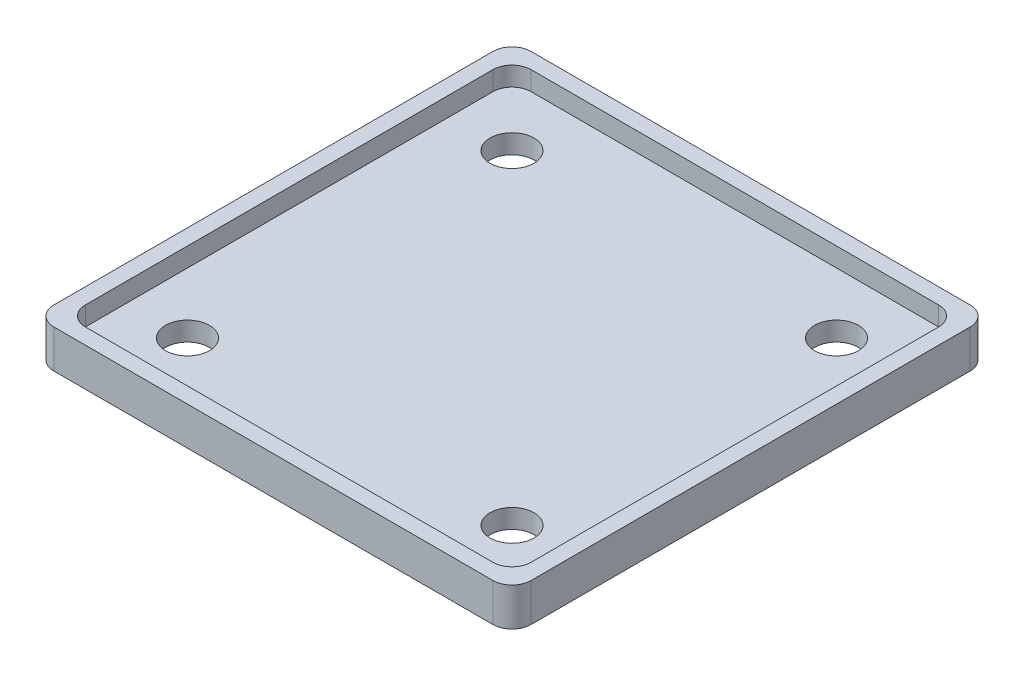
ISO-10303-21;
HEADER;
FILE_DESCRIPTION(('STEP AP214'),'2;1');
FILE_NAME('part.step','',(''),(''),'','','');
FILE_SCHEMA(('AUTOMOTIVE_DESIGN { 1 0 10303 214 1 1 1 1 }'));
ENDSEC;
DATA;
#1=APPLICATION_CONTEXT('core data for automotive mechanical design processes');
#2=APPLICATION_PROTOCOL_DEFINITION('international standard','automotive_design',2000,#1);
#3=PRODUCT_CONTEXT('',#1,'mechanical');
#4=PRODUCT('Part','Part','',(#3));
#5=PRODUCT_RELATED_PRODUCT_CATEGORY('part','',(#4));
#6=PRODUCT_DEFINITION_FORMATION('','',#4);
#7=PRODUCT_DEFINITION_CONTEXT('part definition',#1,'design');
#8=PRODUCT_DEFINITION('design','',#6,#7);
#9=PRODUCT_DEFINITION_SHAPE('','',#8);
#10=(LENGTH_UNIT() NAMED_UNIT(*) SI_UNIT(.MILLI.,.METRE.));
#11=(NAMED_UNIT(*) PLANE_ANGLE_UNIT() SI_UNIT($,.RADIAN.));
#12=(NAMED_UNIT(*) SI_UNIT($,.STERADIAN.) SOLID_ANGLE_UNIT());
#13=UNCERTAINTY_MEASURE_WITH_UNIT(LENGTH_MEASURE(1.E-05),#10,'distance_accuracy_value','');
#14=(GEOMETRIC_REPRESENTATION_CONTEXT(3) GLOBAL_UNCERTAINTY_ASSIGNED_CONTEXT((#13)) GLOBAL_UNIT_ASSIGNED_CONTEXT((#10,
#11,#12)) REPRESENTATION_CONTEXT('',''));
#15=CARTESIAN_POINT('',(0.,0.,0.));
#16=DIRECTION('',(0.,0.,1.));
#17=DIRECTION('',(1.,0.,0.));
#18=AXIS2_PLACEMENT_3D('',#15,#16,#17);
#19=CARTESIAN_POINT('',(-8.5,0.,-8.5));
#20=DIRECTION('',(0.,1.,0.));
#21=DIRECTION('',(0.,0.,1.));
#22=AXIS2_PLACEMENT_3D('',#19,#20,#21);
#23=CYLINDRICAL_SURFACE('',#22,1.15);
#24=CARTESIAN_POINT('',(-8.5,0.,-8.5));
#25=DIRECTION('',(0.,1.,0.));
#26=DIRECTION('',(0.,0.,1.));
#27=AXIS2_PLACEMENT_3D('',#24,#25,#26);
#28=CIRCLE('',#27,1.15);
#29=CARTESIAN_POINT('',(-8.5,0.,-7.35));
#30=VERTEX_POINT('',#29);
#31=EDGE_CURVE('E277',#30,#30,#28,.T.);
#32=ORIENTED_EDGE('',*,*,#31,.F.);
#33=EDGE_LOOP('',(#32));
#34=FACE_BOUND('',#33,.T.);
#35=CARTESIAN_POINT('',(-8.5,1.,-8.5));
#36=DIRECTION('',(0.,1.,0.));
#37=DIRECTION('',(0.,0.,1.));
#38=AXIS2_PLACEMENT_3D('',#35,#36,#37);
#39=CIRCLE('',#38,1.15);
#40=CARTESIAN_POINT('',(-8.5,1.,-7.35));
#41=VERTEX_POINT('',#40);
#42=EDGE_CURVE('E268',#41,#41,#39,.F.);
#43=ORIENTED_EDGE('',*,*,#42,.F.);
#44=EDGE_LOOP('',(#43));
#45=FACE_BOUND('',#44,.T.);
#46=ADVANCED_FACE('F45',(#34,#45),#23,.F.);
#47=CARTESIAN_POINT('',(-8.5,0.,8.5));
#48=DIRECTION('',(0.,1.,0.));
#49=DIRECTION('',(0.,0.,1.));
#50=AXIS2_PLACEMENT_3D('',#47,#48,#49);
#51=CYLINDRICAL_SURFACE('',#50,1.15);
#52=CARTESIAN_POINT('',(-8.5,0.,8.5));
#53=DIRECTION('',(0.,1.,0.));
#54=DIRECTION('',(0.,0.,-1.));
#55=AXIS2_PLACEMENT_3D('',#52,#53,#54);
#56=CIRCLE('',#55,1.15);
#57=CARTESIAN_POINT('',(-8.5,0.,7.35));
#58=VERTEX_POINT('',#57);
#59=EDGE_CURVE('E273',#58,#58,#56,.T.);
#60=ORIENTED_EDGE('',*,*,#59,.F.);
#61=EDGE_LOOP('',(#60));
#62=FACE_BOUND('',#61,.T.);
#63=CARTESIAN_POINT('',(-8.5,1.,8.5));
#64=DIRECTION('',(0.,1.,0.));
#65=DIRECTION('',(0.,0.,1.));
#66=AXIS2_PLACEMENT_3D('',#63,#64,#65);
#67=CIRCLE('',#66,1.15);
#68=CARTESIAN_POINT('',(-8.5,1.,9.65));
#69=VERTEX_POINT('',#68);
#70=EDGE_CURVE('E264',#69,#69,#67,.F.);
#71=ORIENTED_EDGE('',*,*,#70,.F.);
#72=EDGE_LOOP('',(#71));
#73=FACE_BOUND('',#72,.T.);
#74=ADVANCED_FACE('F403',(#62,#73),#51,.F.);
#75=CARTESIAN_POINT('',(8.5,0.,8.5));
#76=DIRECTION('',(0.,1.,0.));
#77=DIRECTION('',(0.,0.,1.));
#78=AXIS2_PLACEMENT_3D('',#75,#76,#77);
#79=CYLINDRICAL_SURFACE('',#78,1.15);
#80=CARTESIAN_POINT('',(8.5,0.,8.5));
#81=DIRECTION('',(0.,1.,0.));
#82=DIRECTION('',(0.,0.,1.));
#83=AXIS2_PLACEMENT_3D('',#80,#81,#82);
#84=CIRCLE('',#83,1.15);
#85=CARTESIAN_POINT('',(8.5,0.,9.65));
#86=VERTEX_POINT('',#85);
#87=EDGE_CURVE('E278',#86,#86,#84,.T.);
#88=ORIENTED_EDGE('',*,*,#87,.F.);
#89=EDGE_LOOP('',(#88));
#90=FACE_BOUND('',#89,.T.);
#91=CARTESIAN_POINT('',(8.5,1.,8.5));
#92=DIRECTION('',(0.,1.,0.));
#93=DIRECTION('',(0.,0.,1.));
#94=AXIS2_PLACEMENT_3D('',#91,#92,#93);
#95=CIRCLE('',#94,1.15);
#96=CARTESIAN_POINT('',(8.5,1.,9.65));
#97=VERTEX_POINT('',#96);
#98=EDGE_CURVE('E260',#97,#97,#95,.F.);
#99=ORIENTED_EDGE('',*,*,#98,.F.);
#100=EDGE_LOOP('',(#99));
#101=FACE_BOUND('',#100,.T.);
#102=ADVANCED_FACE('F409',(#90,#101),#79,.F.);
#103=CARTESIAN_POINT('',(8.5,0.,-8.5));
#104=DIRECTION('',(0.,1.,0.));
#105=DIRECTION('',(0.,0.,1.));
#106=AXIS2_PLACEMENT_3D('',#103,#104,#105);
#107=CYLINDRICAL_SURFACE('',#106,1.15);
#108=CARTESIAN_POINT('',(8.5,0.,-8.5));
#109=DIRECTION('',(0.,1.,0.));
#110=DIRECTION('',(0.,0.,-1.));
#111=AXIS2_PLACEMENT_3D('',#108,#109,#110);
#112=CIRCLE('',#111,1.15);
#113=CARTESIAN_POINT('',(8.5,0.,-9.65));
#114=VERTEX_POINT('',#113);
#115=EDGE_CURVE('E272',#114,#114,#112,.T.);
#116=ORIENTED_EDGE('',*,*,#115,.F.);
#117=EDGE_LOOP('',(#116));
#118=FACE_BOUND('',#117,.T.);
#119=CARTESIAN_POINT('',(8.5,1.,-8.5));
#120=DIRECTION('',(0.,1.,0.));
#121=DIRECTION('',(0.,0.,1.));
#122=AXIS2_PLACEMENT_3D('',#119,#120,#121);
#123=CIRCLE('',#122,1.15);
#124=CARTESIAN_POINT('',(8.5,1.,-7.35));
#125=VERTEX_POINT('',#124);
#126=EDGE_CURVE('E242',#125,#125,#123,.F.);
#127=ORIENTED_EDGE('',*,*,#126,.F.);
#128=EDGE_LOOP('',(#127));
#129=FACE_BOUND('',#128,.T.);
#130=ADVANCED_FACE('F416',(#118,#129),#107,.F.);
#131=CARTESIAN_POINT('',(12.5,2.,12.5));
#132=DIRECTION('',(-1.,0.,0.));
#133=DIRECTION('',(0.,0.,1.));
#134=AXIS2_PLACEMENT_3D('',#131,#132,#133);
#135=PLANE('',#134);
#136=DIRECTION('',(0.,0.,-1.));
#137=VECTOR('',#136,1.);
#138=CARTESIAN_POINT('',(12.5,0.,12.5));
#139=LINE('',#138,#137);
#140=CARTESIAN_POINT('',(12.5,0.,11.5));
#141=VERTEX_POINT('',#140);
#142=CARTESIAN_POINT('',(12.5,0.,-11.5));
#143=VERTEX_POINT('',#142);
#144=EDGE_CURVE('E288',#141,#143,#139,.T.);
#145=ORIENTED_EDGE('',*,*,#144,.T.);
#146=DIRECTION('',(0.,-1.,0.));
#147=VECTOR('',#146,1.);
#148=CARTESIAN_POINT('',(12.5,2.,-11.5));
#149=LINE('',#148,#147);
#150=CARTESIAN_POINT('',(12.5,2.,-11.5));
#151=VERTEX_POINT('',#150);
#152=EDGE_CURVE('E11',#143,#151,#149,.F.);
#153=ORIENTED_EDGE('',*,*,#152,.T.);
#154=DIRECTION('',(0.,0.,-1.));
#155=VECTOR('',#154,1.);
#156=CARTESIAN_POINT('',(12.5,2.,12.5));
#157=LINE('',#156,#155);
#158=CARTESIAN_POINT('',(12.5,2.,11.5));
#159=VERTEX_POINT('',#158);
#160=EDGE_CURVE('E289',#159,#151,#157,.T.);
#161=ORIENTED_EDGE('',*,*,#160,.F.);
#162=DIRECTION('',(0.,-1.,0.));
#163=VECTOR('',#162,1.);
#164=CARTESIAN_POINT('',(12.5,2.,11.5));
#165=LINE('',#164,#163);
#166=EDGE_CURVE('E54',#159,#141,#165,.T.);
#167=ORIENTED_EDGE('',*,*,#166,.T.);
#168=EDGE_LOOP('',(#145,#153,#161,#167));
#169=FACE_BOUND('',#168,.T.);
#170=ADVANCED_FACE('F368',(#169),#135,.F.);
#171=CARTESIAN_POINT('',(-12.5,2.,-12.5));
#172=DIRECTION('',(0.,0.,1.));
#173=DIRECTION('',(1.,0.,0.));
#174=AXIS2_PLACEMENT_3D('',#171,#172,#173);
#175=PLANE('',#174);
#176=DIRECTION('',(-1.,0.,0.));
#177=VECTOR('',#176,1.);
#178=CARTESIAN_POINT('',(-12.5,0.,-12.5));
#179=LINE('',#178,#177);
#180=CARTESIAN_POINT('',(11.5,0.,-12.5));
#181=VERTEX_POINT('',#180);
#182=CARTESIAN_POINT('',(-11.5,0.,-12.5));
#183=VERTEX_POINT('',#182);
#184=EDGE_CURVE('E308',#181,#183,#179,.T.);
#185=ORIENTED_EDGE('',*,*,#184,.T.);
#186=DIRECTION('',(0.,-1.,0.));
#187=VECTOR('',#186,1.);
#188=CARTESIAN_POINT('',(-11.5,2.,-12.5));
#189=LINE('',#188,#187);
#190=CARTESIAN_POINT('',(-11.5,2.,-12.5));
#191=VERTEX_POINT('',#190);
#192=EDGE_CURVE('E343',#183,#191,#189,.F.);
#193=ORIENTED_EDGE('',*,*,#192,.T.);
#194=DIRECTION('',(-1.,0.,0.));
#195=VECTOR('',#194,1.);
#196=CARTESIAN_POINT('',(-12.5,2.,-12.5));
#197=LINE('',#196,#195);
#198=CARTESIAN_POINT('',(11.5,2.,-12.5));
#199=VERTEX_POINT('',#198);
#200=EDGE_CURVE('E293',#199,#191,#197,.T.);
#201=ORIENTED_EDGE('',*,*,#200,.F.);
#202=DIRECTION('',(0.,-1.,0.));
#203=VECTOR('',#202,1.);
#204=CARTESIAN_POINT('',(11.5,2.,-12.5));
#205=LINE('',#204,#203);
#206=EDGE_CURVE('E339',#199,#181,#205,.T.);
#207=ORIENTED_EDGE('',*,*,#206,.T.);
#208=EDGE_LOOP('',(#185,#193,#201,#207));
#209=FACE_BOUND('',#208,.T.);
#210=ADVANCED_FACE('F383',(#209),#175,.F.);
#211=CARTESIAN_POINT('',(-12.5,2.,12.5));
#212=DIRECTION('',(1.,0.,0.));
#213=DIRECTION('',(0.,0.,-1.));
#214=AXIS2_PLACEMENT_3D('',#211,#212,#213);
#215=PLANE('',#214);
#216=DIRECTION('',(0.,0.,1.));
#217=VECTOR('',#216,1.);
#218=CARTESIAN_POINT('',(-12.5,2.,12.5));
#219=LINE('',#218,#217);
#220=CARTESIAN_POINT('',(-12.5,2.,-11.5));
#221=VERTEX_POINT('',#220);
#222=CARTESIAN_POINT('',(-12.5,2.,11.5));
#223=VERTEX_POINT('',#222);
#224=EDGE_CURVE('E298',#221,#223,#219,.T.);
#225=ORIENTED_EDGE('',*,*,#224,.F.);
#226=DIRECTION('',(0.,-1.,0.));
#227=VECTOR('',#226,1.);
#228=CARTESIAN_POINT('',(-12.5,2.,-11.5));
#229=LINE('',#228,#227);
#230=CARTESIAN_POINT('',(-12.5,0.,-11.5));
#231=VERTEX_POINT('',#230);
#232=EDGE_CURVE('E323',#221,#231,#229,.T.);
#233=ORIENTED_EDGE('',*,*,#232,.T.);
#234=DIRECTION('',(0.,0.,1.));
#235=VECTOR('',#234,1.);
#236=CARTESIAN_POINT('',(-12.5,0.,12.5));
#237=LINE('',#236,#235);
#238=CARTESIAN_POINT('',(-12.5,0.,11.5));
#239=VERTEX_POINT('',#238);
#240=EDGE_CURVE('E312',#231,#239,#237,.T.);
#241=ORIENTED_EDGE('',*,*,#240,.T.);
#242=DIRECTION('',(0.,-1.,0.));
#243=VECTOR('',#242,1.);
#244=CARTESIAN_POINT('',(-12.5,2.,11.5));
#245=LINE('',#244,#243);
#246=EDGE_CURVE('E304',#239,#223,#245,.F.);
#247=ORIENTED_EDGE('',*,*,#246,.T.);
#248=EDGE_LOOP('',(#225,#233,#241,#247));
#249=FACE_BOUND('',#248,.T.);
#250=ADVANCED_FACE('F392',(#249),#215,.F.);
#251=CARTESIAN_POINT('',(-12.5,2.,12.5));
#252=DIRECTION('',(0.,0.,-1.));
#253=DIRECTION('',(-1.,0.,0.));
#254=AXIS2_PLACEMENT_3D('',#251,#252,#253);
#255=PLANE('',#254);
#256=DIRECTION('',(1.,0.,0.));
#257=VECTOR('',#256,1.);
#258=CARTESIAN_POINT('',(-12.5,2.,12.5));
#259=LINE('',#258,#257);
#260=CARTESIAN_POINT('',(-11.5,2.,12.5));
#261=VERTEX_POINT('',#260);
#262=CARTESIAN_POINT('',(11.5,2.,12.5));
#263=VERTEX_POINT('',#262);
#264=EDGE_CURVE('E301',#261,#263,#259,.T.);
#265=ORIENTED_EDGE('',*,*,#264,.F.);
#266=DIRECTION('',(0.,-1.,0.));
#267=VECTOR('',#266,1.);
#268=CARTESIAN_POINT('',(-11.5,2.,12.5));
#269=LINE('',#268,#267);
#270=CARTESIAN_POINT('',(-11.5,0.,12.5));
#271=VERTEX_POINT('',#270);
#272=EDGE_CURVE('E359',#261,#271,#269,.T.);
#273=ORIENTED_EDGE('',*,*,#272,.T.);
#274=DIRECTION('',(1.,0.,0.));
#275=VECTOR('',#274,1.);
#276=CARTESIAN_POINT('',(-12.5,0.,12.5));
#277=LINE('',#276,#275);
#278=CARTESIAN_POINT('',(11.5,0.,12.5));
#279=VERTEX_POINT('',#278);
#280=EDGE_CURVE('E294',#271,#279,#277,.T.);
#281=ORIENTED_EDGE('',*,*,#280,.T.);
#282=DIRECTION('',(0.,-1.,0.));
#283=VECTOR('',#282,1.);
#284=CARTESIAN_POINT('',(11.5,2.,12.5));
#285=LINE('',#284,#283);
#286=EDGE_CURVE('E61',#279,#263,#285,.F.);
#287=ORIENTED_EDGE('',*,*,#286,.T.);
#288=EDGE_LOOP('',(#265,#273,#281,#287));
#289=FACE_BOUND('',#288,.T.);
#290=ADVANCED_FACE('F397',(#289),#255,.F.);
#291=CARTESIAN_POINT('',(0.,2.,0.));
#292=DIRECTION('',(0.,-1.,0.));
#293=DIRECTION('',(0.,0.,-1.));
#294=AXIS2_PLACEMENT_3D('',#291,#292,#293);
#295=PLANE('',#294);
#296=DIRECTION('',(0.,0.,-1.));
#297=VECTOR('',#296,1.);
#298=CARTESIAN_POINT('',(11.675,2.,10.675));
#299=LINE('',#298,#297);
#300=CARTESIAN_POINT('',(11.675,2.,10.675));
#301=VERTEX_POINT('',#300);
#302=CARTESIAN_POINT('',(11.675,2.,-10.675));
#303=VERTEX_POINT('',#302);
#304=EDGE_CURVE('E217',#301,#303,#299,.T.);
#305=ORIENTED_EDGE('',*,*,#304,.F.);
#306=CARTESIAN_POINT('',(10.675,2.,10.675));
#307=DIRECTION('',(0.,1.,0.));
#308=DIRECTION('',(0.,0.,1.));
#309=AXIS2_PLACEMENT_3D('',#306,#307,#308);
#310=CIRCLE('',#309,0.999999999999999);
#311=CARTESIAN_POINT('',(10.675,2.,11.675));
#312=VERTEX_POINT('',#311);
#313=EDGE_CURVE('E167',#312,#301,#310,.T.);
#314=ORIENTED_EDGE('',*,*,#313,.F.);
#315=DIRECTION('',(1.,0.,0.));
#316=VECTOR('',#315,1.);
#317=CARTESIAN_POINT('',(10.675,2.,11.675));
#318=LINE('',#317,#316);
#319=CARTESIAN_POINT('',(-10.675,2.,11.675));
#320=VERTEX_POINT('',#319);
#321=EDGE_CURVE('E189',#320,#312,#318,.T.);
#322=ORIENTED_EDGE('',*,*,#321,.F.);
#323=CARTESIAN_POINT('',(-10.675,2.,10.675));
#324=DIRECTION('',(0.,1.,0.));
#325=DIRECTION('',(0.,0.,-1.));
#326=AXIS2_PLACEMENT_3D('',#323,#324,#325);
#327=CIRCLE('',#326,1.);
#328=CARTESIAN_POINT('',(-11.675,2.,10.675));
#329=VERTEX_POINT('',#328);
#330=EDGE_CURVE('E193',#329,#320,#327,.T.);
#331=ORIENTED_EDGE('',*,*,#330,.F.);
#332=DIRECTION('',(0.,0.,1.));
#333=VECTOR('',#332,1.);
#334=CARTESIAN_POINT('',(-11.675,2.,10.675));
#335=LINE('',#334,#333);
#336=CARTESIAN_POINT('',(-11.675,2.,-10.675));
#337=VERTEX_POINT('',#336);
#338=EDGE_CURVE('E232',#337,#329,#335,.T.);
#339=ORIENTED_EDGE('',*,*,#338,.F.);
#340=CARTESIAN_POINT('',(-10.675,2.,-10.675));
#341=DIRECTION('',(0.,1.,0.));
#342=DIRECTION('',(0.,0.,1.));
#343=AXIS2_PLACEMENT_3D('',#340,#341,#342);
#344=CIRCLE('',#343,0.999999999999999);
#345=CARTESIAN_POINT('',(-10.675,2.,-11.675));
#346=VERTEX_POINT('',#345);
#347=EDGE_CURVE('E228',#346,#337,#344,.T.);
#348=ORIENTED_EDGE('',*,*,#347,.F.);
#349=DIRECTION('',(-1.,0.,0.));
#350=VECTOR('',#349,1.);
#351=CARTESIAN_POINT('',(10.675,2.,-11.675));
#352=LINE('',#351,#350);
#353=CARTESIAN_POINT('',(10.675,2.,-11.675));
#354=VERTEX_POINT('',#353);
#355=EDGE_CURVE('E224',#354,#346,#352,.T.);
#356=ORIENTED_EDGE('',*,*,#355,.F.);
#357=CARTESIAN_POINT('',(10.675,2.,-10.675));
#358=DIRECTION('',(0.,1.,0.));
#359=DIRECTION('',(0.,0.,1.));
#360=AXIS2_PLACEMENT_3D('',#357,#358,#359);
#361=CIRCLE('',#360,1.);
#362=EDGE_CURVE('E220',#303,#354,#361,.T.);
#363=ORIENTED_EDGE('',*,*,#362,.F.);
#364=EDGE_LOOP('',(#305,#314,#322,#331,#339,#348,#356,#363));
#365=FACE_BOUND('',#364,.T.);
#366=ORIENTED_EDGE('',*,*,#200,.T.);
#367=CARTESIAN_POINT('',(-11.5,2.,-11.5));
#368=DIRECTION('',(0.,-1.,0.));
#369=DIRECTION('',(0.,0.,-1.));
#370=AXIS2_PLACEMENT_3D('',#367,#368,#369);
#371=CIRCLE('',#370,1.);
#372=EDGE_CURVE('E354',#191,#221,#371,.F.);
#373=ORIENTED_EDGE('',*,*,#372,.T.);
#374=ORIENTED_EDGE('',*,*,#224,.T.);
#375=CARTESIAN_POINT('',(-11.5,2.,11.5));
#376=DIRECTION('',(0.,-1.,0.));
#377=DIRECTION('',(0.,0.,-1.));
#378=AXIS2_PLACEMENT_3D('',#375,#376,#377);
#379=CIRCLE('',#378,1.);
#380=EDGE_CURVE('E68',#223,#261,#379,.F.);
#381=ORIENTED_EDGE('',*,*,#380,.T.);
#382=ORIENTED_EDGE('',*,*,#264,.T.);
#383=CARTESIAN_POINT('',(11.5,2.,11.5));
#384=DIRECTION('',(0.,-1.,0.));
#385=DIRECTION('',(0.,0.,-1.));
#386=AXIS2_PLACEMENT_3D('',#383,#384,#385);
#387=CIRCLE('',#386,1.);
#388=EDGE_CURVE('E346',#263,#159,#387,.F.);
#389=ORIENTED_EDGE('',*,*,#388,.T.);
#390=ORIENTED_EDGE('',*,*,#160,.T.);
#391=CARTESIAN_POINT('',(11.5,2.,-11.5));
#392=DIRECTION('',(0.,-1.,0.));
#393=DIRECTION('',(0.,0.,-1.));
#394=AXIS2_PLACEMENT_3D('',#391,#392,#393);
#395=CIRCLE('',#394,1.);
#396=EDGE_CURVE('E349',#151,#199,#395,.F.);
#397=ORIENTED_EDGE('',*,*,#396,.T.);
#398=EDGE_LOOP('',(#366,#373,#374,#381,#382,#389,#390,#397));
#399=FACE_BOUND('',#398,.T.);
#400=ADVANCED_FACE('F386',(#365,#399),#295,.F.);
#401=CARTESIAN_POINT('',(0.,0.,0.));
#402=DIRECTION('',(0.,-1.,0.));
#403=DIRECTION('',(0.,0.,-1.));
#404=AXIS2_PLACEMENT_3D('',#401,#402,#403);
#405=PLANE('',#404);
#406=ORIENTED_EDGE('',*,*,#115,.T.);
#407=EDGE_LOOP('',(#406));
#408=FACE_BOUND('',#407,.T.);
#409=ORIENTED_EDGE('',*,*,#87,.T.);
#410=EDGE_LOOP('',(#409));
#411=FACE_BOUND('',#410,.T.);
#412=ORIENTED_EDGE('',*,*,#59,.T.);
#413=EDGE_LOOP('',(#412));
#414=FACE_BOUND('',#413,.T.);
#415=ORIENTED_EDGE('',*,*,#31,.T.);
#416=EDGE_LOOP('',(#415));
#417=FACE_BOUND('',#416,.T.);
#418=ORIENTED_EDGE('',*,*,#240,.F.);
#419=CARTESIAN_POINT('',(-11.5,0.,-11.5));
#420=DIRECTION('',(0.,-1.,0.));
#421=DIRECTION('',(0.,0.,-1.));
#422=AXIS2_PLACEMENT_3D('',#419,#420,#421);
#423=CIRCLE('',#422,1.);
#424=EDGE_CURVE('E336',#231,#183,#423,.T.);
#425=ORIENTED_EDGE('',*,*,#424,.T.);
#426=ORIENTED_EDGE('',*,*,#184,.F.);
#427=CARTESIAN_POINT('',(11.5,0.,-11.5));
#428=DIRECTION('',(0.,-1.,0.));
#429=DIRECTION('',(0.,0.,-1.));
#430=AXIS2_PLACEMENT_3D('',#427,#428,#429);
#431=CIRCLE('',#430,1.);
#432=EDGE_CURVE('E330',#181,#143,#431,.T.);
#433=ORIENTED_EDGE('',*,*,#432,.T.);
#434=ORIENTED_EDGE('',*,*,#144,.F.);
#435=CARTESIAN_POINT('',(11.5,0.,11.5));
#436=DIRECTION('',(0.,-1.,0.));
#437=DIRECTION('',(0.,0.,-1.));
#438=AXIS2_PLACEMENT_3D('',#435,#436,#437);
#439=CIRCLE('',#438,1.);
#440=EDGE_CURVE('E327',#141,#279,#439,.T.);
#441=ORIENTED_EDGE('',*,*,#440,.T.);
#442=ORIENTED_EDGE('',*,*,#280,.F.);
#443=CARTESIAN_POINT('',(-11.5,0.,11.5));
#444=DIRECTION('',(0.,-1.,0.));
#445=DIRECTION('',(0.,0.,-1.));
#446=AXIS2_PLACEMENT_3D('',#443,#444,#445);
#447=CIRCLE('',#446,1.);
#448=EDGE_CURVE('E333',#271,#239,#447,.T.);
#449=ORIENTED_EDGE('',*,*,#448,.T.);
#450=EDGE_LOOP('',(#418,#425,#426,#433,#434,#441,#442,#449));
#451=FACE_BOUND('',#450,.T.);
#452=ADVANCED_FACE('F374',(#408,#411,#414,#417,#451),#405,.T.);
#453=CARTESIAN_POINT('',(10.675,1.,10.675));
#454=DIRECTION('',(0.,1.,0.));
#455=DIRECTION('',(0.,0.,1.));
#456=AXIS2_PLACEMENT_3D('',#453,#454,#455);
#457=PLANE('',#456);
#458=CARTESIAN_POINT('',(10.675,1.,10.675));
#459=DIRECTION('',(0.,1.,0.));
#460=DIRECTION('',(0.,0.,1.));
#461=AXIS2_PLACEMENT_3D('',#458,#459,#460);
#462=CIRCLE('',#461,0.999999999999999);
#463=CARTESIAN_POINT('',(10.675,1.,11.675));
#464=VERTEX_POINT('',#463);
#465=CARTESIAN_POINT('',(11.675,1.,10.675));
#466=VERTEX_POINT('',#465);
#467=EDGE_CURVE('E164',#464,#466,#462,.T.);
#468=ORIENTED_EDGE('',*,*,#467,.T.);
#469=DIRECTION('',(0.,0.,-1.));
#470=VECTOR('',#469,1.);
#471=CARTESIAN_POINT('',(11.675,1.,10.675));
#472=LINE('',#471,#470);
#473=CARTESIAN_POINT('',(11.675,1.,-10.675));
#474=VERTEX_POINT('',#473);
#475=EDGE_CURVE('E176',#466,#474,#472,.T.);
#476=ORIENTED_EDGE('',*,*,#475,.T.);
#477=CARTESIAN_POINT('',(10.675,1.,-10.675));
#478=DIRECTION('',(0.,1.,0.));
#479=DIRECTION('',(0.,0.,1.));
#480=AXIS2_PLACEMENT_3D('',#477,#478,#479);
#481=CIRCLE('',#480,1.);
#482=CARTESIAN_POINT('',(10.675,1.,-11.675));
#483=VERTEX_POINT('',#482);
#484=EDGE_CURVE('E182',#474,#483,#481,.T.);
#485=ORIENTED_EDGE('',*,*,#484,.T.);
#486=DIRECTION('',(-1.,0.,0.));
#487=VECTOR('',#486,1.);
#488=CARTESIAN_POINT('',(10.675,1.,-11.675));
#489=LINE('',#488,#487);
#490=CARTESIAN_POINT('',(-10.675,1.,-11.675));
#491=VERTEX_POINT('',#490);
#492=EDGE_CURVE('E198',#483,#491,#489,.T.);
#493=ORIENTED_EDGE('',*,*,#492,.T.);
#494=CARTESIAN_POINT('',(-10.675,1.,-10.675));
#495=DIRECTION('',(0.,1.,0.));
#496=DIRECTION('',(0.,0.,1.));
#497=AXIS2_PLACEMENT_3D('',#494,#495,#496);
#498=CIRCLE('',#497,0.999999999999999);
#499=CARTESIAN_POINT('',(-11.675,1.,-10.675));
#500=VERTEX_POINT('',#499);
#501=EDGE_CURVE('E202',#491,#500,#498,.T.);
#502=ORIENTED_EDGE('',*,*,#501,.T.);
#503=DIRECTION('',(0.,0.,1.));
#504=VECTOR('',#503,1.);
#505=CARTESIAN_POINT('',(-11.675,1.,10.675));
#506=LINE('',#505,#504);
#507=CARTESIAN_POINT('',(-11.675,1.,10.675));
#508=VERTEX_POINT('',#507);
#509=EDGE_CURVE('E206',#500,#508,#506,.T.);
#510=ORIENTED_EDGE('',*,*,#509,.T.);
#511=CARTESIAN_POINT('',(-10.675,1.,10.675));
#512=DIRECTION('',(0.,1.,0.));
#513=DIRECTION('',(0.,0.,-1.));
#514=AXIS2_PLACEMENT_3D('',#511,#512,#513);
#515=CIRCLE('',#514,1.);
#516=CARTESIAN_POINT('',(-10.675,1.,11.675));
#517=VERTEX_POINT('',#516);
#518=EDGE_CURVE('E210',#508,#517,#515,.T.);
#519=ORIENTED_EDGE('',*,*,#518,.T.);
#520=DIRECTION('',(1.,0.,0.));
#521=VECTOR('',#520,1.);
#522=CARTESIAN_POINT('',(10.675,1.,11.675));
#523=LINE('',#522,#521);
#524=EDGE_CURVE('E173',#517,#464,#523,.T.);
#525=ORIENTED_EDGE('',*,*,#524,.T.);
#526=EDGE_LOOP('',(#468,#476,#485,#493,#502,#510,#519,#525));
#527=FACE_BOUND('',#526,.T.);
#528=ORIENTED_EDGE('',*,*,#126,.T.);
#529=EDGE_LOOP('',(#528));
#530=FACE_BOUND('',#529,.T.);
#531=ORIENTED_EDGE('',*,*,#98,.T.);
#532=EDGE_LOOP('',(#531));
#533=FACE_BOUND('',#532,.T.);
#534=ORIENTED_EDGE('',*,*,#70,.T.);
#535=EDGE_LOOP('',(#534));
#536=FACE_BOUND('',#535,.T.);
#537=ORIENTED_EDGE('',*,*,#42,.T.);
#538=EDGE_LOOP('',(#537));
#539=FACE_BOUND('',#538,.T.);
#540=ADVANCED_FACE('F184',(#527,#530,#533,#536,#539),#457,.T.);
#541=CARTESIAN_POINT('',(10.675,1.,10.675));
#542=DIRECTION('',(0.,1.,0.));
#543=DIRECTION('',(0.,0.,1.));
#544=AXIS2_PLACEMENT_3D('',#541,#542,#543);
#545=CYLINDRICAL_SURFACE('',#544,0.999999999999999);
#546=ORIENTED_EDGE('',*,*,#313,.T.);
#547=DIRECTION('',(0.,1.,0.));
#548=VECTOR('',#547,1.);
#549=CARTESIAN_POINT('',(11.675,1.,10.675));
#550=LINE('',#549,#548);
#551=EDGE_CURVE('E160',#466,#301,#550,.T.);
#552=ORIENTED_EDGE('',*,*,#551,.F.);
#553=ORIENTED_EDGE('',*,*,#467,.F.);
#554=DIRECTION('',(0.,1.,0.));
#555=VECTOR('',#554,1.);
#556=CARTESIAN_POINT('',(10.675,1.,11.675));
#557=LINE('',#556,#555);
#558=EDGE_CURVE('E239',#464,#312,#557,.T.);
#559=ORIENTED_EDGE('',*,*,#558,.T.);
#560=EDGE_LOOP('',(#546,#552,#553,#559));
#561=FACE_BOUND('',#560,.T.);
#562=ADVANCED_FACE('F162',(#561),#545,.F.);
#563=CARTESIAN_POINT('',(10.675,1.,11.675));
#564=DIRECTION('',(0.,0.,1.));
#565=DIRECTION('',(1.,0.,0.));
#566=AXIS2_PLACEMENT_3D('',#563,#564,#565);
#567=PLANE('',#566);
#568=ORIENTED_EDGE('',*,*,#321,.T.);
#569=ORIENTED_EDGE('',*,*,#558,.F.);
#570=ORIENTED_EDGE('',*,*,#524,.F.);
#571=DIRECTION('',(0.,1.,0.));
#572=VECTOR('',#571,1.);
#573=CARTESIAN_POINT('',(-10.675,1.,11.675));
#574=LINE('',#573,#572);
#575=EDGE_CURVE('E243',#517,#320,#574,.T.);
#576=ORIENTED_EDGE('',*,*,#575,.T.);
#577=EDGE_LOOP('',(#568,#569,#570,#576));
#578=FACE_BOUND('',#577,.T.);
#579=ADVANCED_FACE('F506',(#578),#567,.F.);
#580=CARTESIAN_POINT('',(-10.675,1.,10.675));
#581=DIRECTION('',(0.,1.,0.));
#582=DIRECTION('',(0.,0.,1.));
#583=AXIS2_PLACEMENT_3D('',#580,#581,#582);
#584=CYLINDRICAL_SURFACE('',#583,1.);
#585=ORIENTED_EDGE('',*,*,#330,.T.);
#586=ORIENTED_EDGE('',*,*,#575,.F.);
#587=ORIENTED_EDGE('',*,*,#518,.F.);
#588=DIRECTION('',(0.,1.,0.));
#589=VECTOR('',#588,1.);
#590=CARTESIAN_POINT('',(-11.675,1.,10.675));
#591=LINE('',#590,#589);
#592=EDGE_CURVE('E246',#508,#329,#591,.T.);
#593=ORIENTED_EDGE('',*,*,#592,.T.);
#594=EDGE_LOOP('',(#585,#586,#587,#593));
#595=FACE_BOUND('',#594,.T.);
#596=ADVANCED_FACE('F497',(#595),#584,.F.);
#597=CARTESIAN_POINT('',(-11.675,1.,10.675));
#598=DIRECTION('',(-1.,0.,0.));
#599=DIRECTION('',(0.,0.,1.));
#600=AXIS2_PLACEMENT_3D('',#597,#598,#599);
#601=PLANE('',#600);
#602=ORIENTED_EDGE('',*,*,#338,.T.);
#603=ORIENTED_EDGE('',*,*,#592,.F.);
#604=ORIENTED_EDGE('',*,*,#509,.F.);
#605=DIRECTION('',(0.,1.,0.));
#606=VECTOR('',#605,1.);
#607=CARTESIAN_POINT('',(-11.675,1.,-10.675));
#608=LINE('',#607,#606);
#609=EDGE_CURVE('E249',#500,#337,#608,.T.);
#610=ORIENTED_EDGE('',*,*,#609,.T.);
#611=EDGE_LOOP('',(#602,#603,#604,#610));
#612=FACE_BOUND('',#611,.T.);
#613=ADVANCED_FACE('F488',(#612),#601,.F.);
#614=CARTESIAN_POINT('',(-10.675,1.,-10.675));
#615=DIRECTION('',(0.,1.,0.));
#616=DIRECTION('',(0.,0.,1.));
#617=AXIS2_PLACEMENT_3D('',#614,#615,#616);
#618=CYLINDRICAL_SURFACE('',#617,0.999999999999999);
#619=ORIENTED_EDGE('',*,*,#347,.T.);
#620=ORIENTED_EDGE('',*,*,#609,.F.);
#621=ORIENTED_EDGE('',*,*,#501,.F.);
#622=DIRECTION('',(0.,1.,0.));
#623=VECTOR('',#622,1.);
#624=CARTESIAN_POINT('',(-10.675,1.,-11.675));
#625=LINE('',#624,#623);
#626=EDGE_CURVE('E252',#491,#346,#625,.T.);
#627=ORIENTED_EDGE('',*,*,#626,.T.);
#628=EDGE_LOOP('',(#619,#620,#621,#627));
#629=FACE_BOUND('',#628,.T.);
#630=ADVANCED_FACE('F479',(#629),#618,.F.);
#631=CARTESIAN_POINT('',(10.675,1.,-11.675));
#632=DIRECTION('',(0.,0.,-1.));
#633=DIRECTION('',(-1.,0.,0.));
#634=AXIS2_PLACEMENT_3D('',#631,#632,#633);
#635=PLANE('',#634);
#636=ORIENTED_EDGE('',*,*,#355,.T.);
#637=ORIENTED_EDGE('',*,*,#626,.F.);
#638=ORIENTED_EDGE('',*,*,#492,.F.);
#639=DIRECTION('',(0.,1.,0.));
#640=VECTOR('',#639,1.);
#641=CARTESIAN_POINT('',(10.675,1.,-11.675));
#642=LINE('',#641,#640);
#643=EDGE_CURVE('E255',#483,#354,#642,.T.);
#644=ORIENTED_EDGE('',*,*,#643,.T.);
#645=EDGE_LOOP('',(#636,#637,#638,#644));
#646=FACE_BOUND('',#645,.T.);
#647=ADVANCED_FACE('F470',(#646),#635,.F.);
#648=CARTESIAN_POINT('',(10.675,1.,-10.675));
#649=DIRECTION('',(0.,1.,0.));
#650=DIRECTION('',(0.,0.,1.));
#651=AXIS2_PLACEMENT_3D('',#648,#649,#650);
#652=CYLINDRICAL_SURFACE('',#651,1.);
#653=ORIENTED_EDGE('',*,*,#362,.T.);
#654=ORIENTED_EDGE('',*,*,#643,.F.);
#655=ORIENTED_EDGE('',*,*,#484,.F.);
#656=DIRECTION('',(0.,1.,0.));
#657=VECTOR('',#656,1.);
#658=CARTESIAN_POINT('',(11.675,1.,-10.675));
#659=LINE('',#658,#657);
#660=EDGE_CURVE('E172',#474,#303,#659,.T.);
#661=ORIENTED_EDGE('',*,*,#660,.T.);
#662=EDGE_LOOP('',(#653,#654,#655,#661));
#663=FACE_BOUND('',#662,.T.);
#664=ADVANCED_FACE('F462',(#663),#652,.F.);
#665=CARTESIAN_POINT('',(11.675,1.,10.675));
#666=DIRECTION('',(1.,0.,0.));
#667=DIRECTION('',(0.,0.,-1.));
#668=AXIS2_PLACEMENT_3D('',#665,#666,#667);
#669=PLANE('',#668);
#670=ORIENTED_EDGE('',*,*,#304,.T.);
#671=ORIENTED_EDGE('',*,*,#660,.F.);
#672=ORIENTED_EDGE('',*,*,#475,.F.);
#673=ORIENTED_EDGE('',*,*,#551,.T.);
#674=EDGE_LOOP('',(#670,#671,#672,#673));
#675=FACE_BOUND('',#674,.T.);
#676=ADVANCED_FACE('F177',(#675),#669,.F.);
#677=CARTESIAN_POINT('',(-11.5,2.,-11.5));
#678=DIRECTION('',(0.,-1.,0.));
#679=DIRECTION('',(0.,0.,-1.));
#680=AXIS2_PLACEMENT_3D('',#677,#678,#679);
#681=CYLINDRICAL_SURFACE('',#680,1.);
#682=ORIENTED_EDGE('',*,*,#372,.F.);
#683=ORIENTED_EDGE('',*,*,#192,.F.);
#684=ORIENTED_EDGE('',*,*,#424,.F.);
#685=ORIENTED_EDGE('',*,*,#232,.F.);
#686=EDGE_LOOP('',(#682,#683,#684,#685));
#687=FACE_BOUND('',#686,.T.);
#688=ADVANCED_FACE('F390',(#687),#681,.T.);
#689=CARTESIAN_POINT('',(-11.5,2.,11.5));
#690=DIRECTION('',(0.,-1.,0.));
#691=DIRECTION('',(0.,0.,-1.));
#692=AXIS2_PLACEMENT_3D('',#689,#690,#691);
#693=CYLINDRICAL_SURFACE('',#692,1.);
#694=ORIENTED_EDGE('',*,*,#380,.F.);
#695=ORIENTED_EDGE('',*,*,#246,.F.);
#696=ORIENTED_EDGE('',*,*,#448,.F.);
#697=ORIENTED_EDGE('',*,*,#272,.F.);
#698=EDGE_LOOP('',(#694,#695,#696,#697));
#699=FACE_BOUND('',#698,.T.);
#700=ADVANCED_FACE('F396',(#699),#693,.T.);
#701=CARTESIAN_POINT('',(11.5,2.,-11.5));
#702=DIRECTION('',(0.,-1.,0.));
#703=DIRECTION('',(0.,0.,-1.));
#704=AXIS2_PLACEMENT_3D('',#701,#702,#703);
#705=CYLINDRICAL_SURFACE('',#704,1.);
#706=ORIENTED_EDGE('',*,*,#396,.F.);
#707=ORIENTED_EDGE('',*,*,#152,.F.);
#708=ORIENTED_EDGE('',*,*,#432,.F.);
#709=ORIENTED_EDGE('',*,*,#206,.F.);
#710=EDGE_LOOP('',(#706,#707,#708,#709));
#711=FACE_BOUND('',#710,.T.);
#712=ADVANCED_FACE('F380',(#711),#705,.T.);
#713=CARTESIAN_POINT('',(11.5,2.,11.5));
#714=DIRECTION('',(0.,-1.,0.));
#715=DIRECTION('',(0.,0.,-1.));
#716=AXIS2_PLACEMENT_3D('',#713,#714,#715);
#717=CYLINDRICAL_SURFACE('',#716,1.);
#718=ORIENTED_EDGE('',*,*,#388,.F.);
#719=ORIENTED_EDGE('',*,*,#286,.F.);
#720=ORIENTED_EDGE('',*,*,#440,.F.);
#721=ORIENTED_EDGE('',*,*,#166,.F.);
#722=EDGE_LOOP('',(#718,#719,#720,#721));
#723=FACE_BOUND('',#722,.T.);
#724=ADVANCED_FACE('F47',(#723),#717,.T.);
#725=CLOSED_SHELL('',(#46,#74,#102,#130,#170,#210,#250,#290,#400,#452,#540,#562,#579,#596,#613,
#630,#647,#664,#676,#688,#700,#712,#724));
#726=MANIFOLD_SOLID_BREP('B2',#725);
#727=ADVANCED_BREP_SHAPE_REPRESENTATION('',(#18,#726),#14);
#728=SHAPE_DEFINITION_REPRESENTATION(#9,#727);
ENDSEC;
END-ISO-10303-21;
